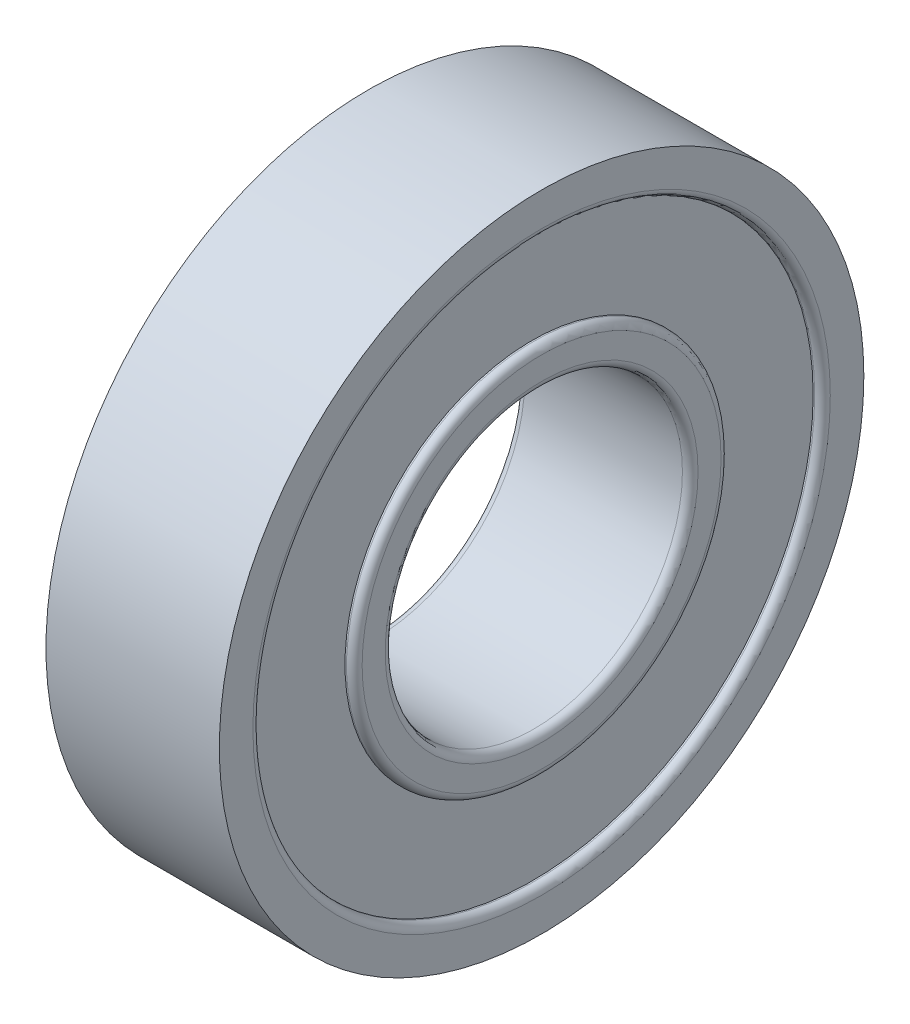
ISO-10303-21;
HEADER;
FILE_DESCRIPTION(('STEP AP214'),'2;1');
FILE_NAME('part.step','',(''),(''),'','','');
FILE_SCHEMA(('AUTOMOTIVE_DESIGN { 1 0 10303 214 1 1 1 1 }'));
ENDSEC;
DATA;
#1=APPLICATION_CONTEXT('core data for automotive mechanical design processes');
#2=APPLICATION_PROTOCOL_DEFINITION('international standard','automotive_design',2000,#1);
#3=PRODUCT_CONTEXT('',#1,'mechanical');
#4=PRODUCT('Part','Part','',(#3));
#5=PRODUCT_RELATED_PRODUCT_CATEGORY('part','',(#4));
#6=PRODUCT_DEFINITION_FORMATION('','',#4);
#7=PRODUCT_DEFINITION_CONTEXT('part definition',#1,'design');
#8=PRODUCT_DEFINITION('design','',#6,#7);
#9=PRODUCT_DEFINITION_SHAPE('','',#8);
#10=(LENGTH_UNIT() NAMED_UNIT(*) SI_UNIT(.MILLI.,.METRE.));
#11=(NAMED_UNIT(*) PLANE_ANGLE_UNIT() SI_UNIT($,.RADIAN.));
#12=(NAMED_UNIT(*) SI_UNIT($,.STERADIAN.) SOLID_ANGLE_UNIT());
#13=UNCERTAINTY_MEASURE_WITH_UNIT(LENGTH_MEASURE(1.E-05),#10,'distance_accuracy_value','');
#14=(GEOMETRIC_REPRESENTATION_CONTEXT(3) GLOBAL_UNCERTAINTY_ASSIGNED_CONTEXT((#13)) GLOBAL_UNIT_ASSIGNED_CONTEXT((#10,
#11,#12)) REPRESENTATION_CONTEXT('',''));
#15=CARTESIAN_POINT('',(0.,0.,0.));
#16=DIRECTION('',(0.,0.,1.));
#17=DIRECTION('',(1.,0.,0.));
#18=AXIS2_PLACEMENT_3D('',#15,#16,#17);
#19=CARTESIAN_POINT('',(-5.555,0.,0.));
#20=DIRECTION('',(1.,0.,0.));
#21=DIRECTION('',(0.,0.,-1.));
#22=AXIS2_PLACEMENT_3D('',#19,#20,#21);
#23=PLANE('',#22);
#24=CARTESIAN_POINT('',(-5.555,0.,0.));
#25=DIRECTION('',(1.,0.,0.));
#26=DIRECTION('',(0.,0.,-1.));
#27=AXIS2_PLACEMENT_3D('',#24,#25,#26);
#28=CIRCLE('',#27,11.5);
#29=CARTESIAN_POINT('',(-5.555,0.,-11.5));
#30=VERTEX_POINT('',#29);
#31=EDGE_CURVE('E74',#30,#30,#28,.F.);
#32=ORIENTED_EDGE('',*,*,#31,.T.);
#33=EDGE_LOOP('',(#32));
#34=FACE_BOUND('',#33,.T.);
#35=CARTESIAN_POINT('',(-5.555,0.,0.));
#36=DIRECTION('',(1.,0.,0.));
#37=DIRECTION('',(0.,0.,-1.));
#38=AXIS2_PLACEMENT_3D('',#35,#36,#37);
#39=CIRCLE('',#38,10.025);
#40=CARTESIAN_POINT('',(-5.555,0.,-10.025));
#41=VERTEX_POINT('',#40);
#42=EDGE_CURVE('E77',#41,#41,#39,.T.);
#43=ORIENTED_EDGE('',*,*,#42,.T.);
#44=EDGE_LOOP('',(#43));
#45=FACE_BOUND('',#44,.T.);
#46=ADVANCED_FACE('F45',(#34,#45),#23,.F.);
#47=CARTESIAN_POINT('',(5.555,0.,0.));
#48=DIRECTION('',(1.,0.,0.));
#49=DIRECTION('',(0.,0.,-1.));
#50=AXIS2_PLACEMENT_3D('',#47,#48,#49);
#51=PLANE('',#50);
#52=CARTESIAN_POINT('',(5.555,0.,0.));
#53=DIRECTION('',(1.,0.,0.));
#54=DIRECTION('',(0.,0.,-1.));
#55=AXIS2_PLACEMENT_3D('',#52,#53,#54);
#56=CIRCLE('',#55,10.025);
#57=CARTESIAN_POINT('',(5.555,0.,-10.025));
#58=VERTEX_POINT('',#57);
#59=EDGE_CURVE('E60',#58,#58,#56,.F.);
#60=ORIENTED_EDGE('',*,*,#59,.T.);
#61=EDGE_LOOP('',(#60));
#62=FACE_BOUND('',#61,.T.);
#63=CARTESIAN_POINT('',(5.555,0.,0.));
#64=DIRECTION('',(1.,0.,0.));
#65=DIRECTION('',(0.,0.,-1.));
#66=AXIS2_PLACEMENT_3D('',#63,#64,#65);
#67=CIRCLE('',#66,11.5);
#68=CARTESIAN_POINT('',(5.555,0.,-11.5));
#69=VERTEX_POINT('',#68);
#70=EDGE_CURVE('E65',#69,#69,#67,.T.);
#71=ORIENTED_EDGE('',*,*,#70,.T.);
#72=EDGE_LOOP('',(#71));
#73=FACE_BOUND('',#72,.T.);
#74=ADVANCED_FACE('F127',(#62,#73),#51,.T.);
#75=CARTESIAN_POINT('',(5.555,0.,0.));
#76=DIRECTION('',(1.,0.,0.));
#77=DIRECTION('',(0.,0.,-1.));
#78=AXIS2_PLACEMENT_3D('',#75,#76,#77);
#79=CIRCLE('',#78,18.5);
#80=CARTESIAN_POINT('',(5.555,0.,-18.5));
#81=VERTEX_POINT('',#80);
#82=EDGE_CURVE('E10',#81,#81,#79,.F.);
#83=ORIENTED_EDGE('',*,*,#82,.T.);
#84=EDGE_LOOP('',(#83));
#85=FACE_BOUND('',#84,.T.);
#86=CARTESIAN_POINT('',(5.555,0.,0.));
#87=DIRECTION('',(1.,0.,0.));
#88=DIRECTION('',(0.,0.,-1.));
#89=AXIS2_PLACEMENT_3D('',#86,#87,#88);
#90=CIRCLE('',#89,20.65);
#91=CARTESIAN_POINT('',(5.555,0.,-20.65));
#92=VERTEX_POINT('',#91);
#93=EDGE_CURVE('E89',#92,#92,#90,.T.);
#94=ORIENTED_EDGE('',*,*,#93,.T.);
#95=EDGE_LOOP('',(#94));
#96=FACE_BOUND('',#95,.T.);
#97=ADVANCED_FACE('F135',(#85,#96),#51,.T.);
#98=CARTESIAN_POINT('',(-5.555,0.,0.));
#99=DIRECTION('',(1.,0.,0.));
#100=DIRECTION('',(0.,0.,-1.));
#101=AXIS2_PLACEMENT_3D('',#98,#99,#100);
#102=CIRCLE('',#101,18.5);
#103=CARTESIAN_POINT('',(-5.555,0.,-18.5));
#104=VERTEX_POINT('',#103);
#105=EDGE_CURVE('E86',#104,#104,#102,.T.);
#106=ORIENTED_EDGE('',*,*,#105,.T.);
#107=EDGE_LOOP('',(#106));
#108=FACE_BOUND('',#107,.T.);
#109=CARTESIAN_POINT('',(-5.555,0.,0.));
#110=DIRECTION('',(1.,0.,0.));
#111=DIRECTION('',(0.,0.,-1.));
#112=AXIS2_PLACEMENT_3D('',#109,#110,#111);
#113=CIRCLE('',#112,20.65);
#114=CARTESIAN_POINT('',(-5.555,0.,-20.65));
#115=VERTEX_POINT('',#114);
#116=EDGE_CURVE('E90',#115,#115,#113,.T.);
#117=ORIENTED_EDGE('',*,*,#116,.F.);
#118=EDGE_LOOP('',(#117));
#119=FACE_BOUND('',#118,.T.);
#120=ADVANCED_FACE('F130',(#108,#119),#23,.F.);
#121=CARTESIAN_POINT('',(5.555,0.,0.));
#122=DIRECTION('',(-1.,0.,0.));
#123=DIRECTION('',(0.,0.,1.));
#124=AXIS2_PLACEMENT_3D('',#121,#122,#123);
#125=CYLINDRICAL_SURFACE('',#124,20.65);
#126=ORIENTED_EDGE('',*,*,#93,.F.);
#127=EDGE_LOOP('',(#126));
#128=FACE_BOUND('',#127,.T.);
#129=ORIENTED_EDGE('',*,*,#116,.T.);
#130=EDGE_LOOP('',(#129));
#131=FACE_BOUND('',#130,.T.);
#132=ADVANCED_FACE('F141',(#128,#131),#125,.T.);
#133=CARTESIAN_POINT('',(5.555,0.,0.));
#134=DIRECTION('',(-1.,0.,0.));
#135=DIRECTION('',(0.,0.,1.));
#136=AXIS2_PLACEMENT_3D('',#133,#134,#135);
#137=CYLINDRICAL_SURFACE('',#136,9.525);
#138=CARTESIAN_POINT('',(-5.055,0.,0.));
#139=DIRECTION('',(1.,0.,0.));
#140=DIRECTION('',(0.,0.,-1.));
#141=AXIS2_PLACEMENT_3D('',#138,#139,#140);
#142=CIRCLE('',#141,9.525);
#143=CARTESIAN_POINT('',(-5.055,0.,-9.525));
#144=VERTEX_POINT('',#143);
#145=EDGE_CURVE('E68',#144,#144,#142,.F.);
#146=ORIENTED_EDGE('',*,*,#145,.T.);
#147=EDGE_LOOP('',(#146));
#148=FACE_BOUND('',#147,.T.);
#149=CARTESIAN_POINT('',(5.055,0.,0.));
#150=DIRECTION('',(1.,0.,0.));
#151=DIRECTION('',(0.,0.,-1.));
#152=AXIS2_PLACEMENT_3D('',#149,#150,#151);
#153=CIRCLE('',#152,9.525);
#154=CARTESIAN_POINT('',(5.055,0.,-9.525));
#155=VERTEX_POINT('',#154);
#156=EDGE_CURVE('E71',#155,#155,#153,.T.);
#157=ORIENTED_EDGE('',*,*,#156,.T.);
#158=EDGE_LOOP('',(#157));
#159=FACE_BOUND('',#158,.T.);
#160=ADVANCED_FACE('F148',(#148,#159),#137,.F.);
#161=CARTESIAN_POINT('',(4.955,0.,0.));
#162=DIRECTION('',(1.,0.,0.));
#163=DIRECTION('',(0.,0.,-1.));
#164=AXIS2_PLACEMENT_3D('',#161,#162,#163);
#165=CYLINDRICAL_SURFACE('',#164,18.);
#166=CARTESIAN_POINT('',(5.055,0.,0.));
#167=DIRECTION('',(1.,0.,0.));
#168=DIRECTION('',(0.,0.,-1.));
#169=AXIS2_PLACEMENT_3D('',#166,#167,#168);
#170=CIRCLE('',#169,18.);
#171=CARTESIAN_POINT('',(5.055,0.,-18.));
#172=VERTEX_POINT('',#171);
#173=EDGE_CURVE('E52',#172,#172,#170,.T.);
#174=ORIENTED_EDGE('',*,*,#173,.T.);
#175=EDGE_LOOP('',(#174));
#176=FACE_BOUND('',#175,.T.);
#177=CARTESIAN_POINT('',(4.955,0.,0.));
#178=DIRECTION('',(1.,0.,0.));
#179=DIRECTION('',(0.,0.,-1.));
#180=AXIS2_PLACEMENT_3D('',#177,#178,#179);
#181=CIRCLE('',#180,18.);
#182=CARTESIAN_POINT('',(4.955,0.,-18.));
#183=VERTEX_POINT('',#182);
#184=EDGE_CURVE('E93',#183,#183,#181,.T.);
#185=ORIENTED_EDGE('',*,*,#184,.F.);
#186=EDGE_LOOP('',(#185));
#187=FACE_BOUND('',#186,.T.);
#188=ADVANCED_FACE('F160',(#176,#187),#165,.F.);
#189=CARTESIAN_POINT('',(4.955,0.,0.));
#190=DIRECTION('',(1.,0.,0.));
#191=DIRECTION('',(0.,0.,-1.));
#192=AXIS2_PLACEMENT_3D('',#189,#190,#191);
#193=PLANE('',#192);
#194=CARTESIAN_POINT('',(4.955,0.,0.));
#195=DIRECTION('',(1.,0.,0.));
#196=DIRECTION('',(0.,0.,-1.));
#197=AXIS2_PLACEMENT_3D('',#194,#195,#196);
#198=CIRCLE('',#197,12.);
#199=CARTESIAN_POINT('',(4.955,0.,-12.));
#200=VERTEX_POINT('',#199);
#201=EDGE_CURVE('E98',#200,#200,#198,.T.);
#202=ORIENTED_EDGE('',*,*,#201,.F.);
#203=EDGE_LOOP('',(#202));
#204=FACE_BOUND('',#203,.T.);
#205=ORIENTED_EDGE('',*,*,#184,.T.);
#206=EDGE_LOOP('',(#205));
#207=FACE_BOUND('',#206,.T.);
#208=ADVANCED_FACE('F164',(#204,#207),#193,.T.);
#209=CARTESIAN_POINT('',(4.955,0.,0.));
#210=DIRECTION('',(1.,0.,0.));
#211=DIRECTION('',(0.,0.,-1.));
#212=AXIS2_PLACEMENT_3D('',#209,#210,#211);
#213=CYLINDRICAL_SURFACE('',#212,12.);
#214=CARTESIAN_POINT('',(5.055,0.,0.));
#215=DIRECTION('',(1.,0.,0.));
#216=DIRECTION('',(0.,0.,-1.));
#217=AXIS2_PLACEMENT_3D('',#214,#215,#216);
#218=CIRCLE('',#217,12.);
#219=CARTESIAN_POINT('',(5.055,0.,-12.));
#220=VERTEX_POINT('',#219);
#221=EDGE_CURVE('E56',#220,#220,#218,.F.);
#222=ORIENTED_EDGE('',*,*,#221,.T.);
#223=EDGE_LOOP('',(#222));
#224=FACE_BOUND('',#223,.T.);
#225=ORIENTED_EDGE('',*,*,#201,.T.);
#226=EDGE_LOOP('',(#225));
#227=FACE_BOUND('',#226,.T.);
#228=ADVANCED_FACE('F167',(#224,#227),#213,.T.);
#229=CARTESIAN_POINT('',(-4.955,0.,0.));
#230=DIRECTION('',(-1.,0.,0.));
#231=DIRECTION('',(0.,0.,-1.));
#232=AXIS2_PLACEMENT_3D('',#229,#230,#231);
#233=PLANE('',#232);
#234=CARTESIAN_POINT('',(-4.955,0.,0.));
#235=DIRECTION('',(1.,0.,0.));
#236=DIRECTION('',(0.,0.,-1.));
#237=AXIS2_PLACEMENT_3D('',#234,#235,#236);
#238=CIRCLE('',#237,18.);
#239=CARTESIAN_POINT('',(-4.955,0.,-18.));
#240=VERTEX_POINT('',#239);
#241=EDGE_CURVE('E101',#240,#240,#238,.T.);
#242=ORIENTED_EDGE('',*,*,#241,.F.);
#243=EDGE_LOOP('',(#242));
#244=FACE_BOUND('',#243,.T.);
#245=CARTESIAN_POINT('',(-4.955,0.,0.));
#246=DIRECTION('',(1.,0.,0.));
#247=DIRECTION('',(0.,0.,-1.));
#248=AXIS2_PLACEMENT_3D('',#245,#246,#247);
#249=CIRCLE('',#248,12.);
#250=CARTESIAN_POINT('',(-4.955,0.,-12.));
#251=VERTEX_POINT('',#250);
#252=EDGE_CURVE('E104',#251,#251,#249,.T.);
#253=ORIENTED_EDGE('',*,*,#252,.T.);
#254=EDGE_LOOP('',(#253));
#255=FACE_BOUND('',#254,.T.);
#256=ADVANCED_FACE('F108',(#244,#255),#233,.T.);
#257=CARTESIAN_POINT('',(-4.955,0.,0.));
#258=DIRECTION('',(-1.,0.,0.));
#259=DIRECTION('',(0.,0.,1.));
#260=AXIS2_PLACEMENT_3D('',#257,#258,#259);
#261=CYLINDRICAL_SURFACE('',#260,18.);
#262=CARTESIAN_POINT('',(-5.055,0.,0.));
#263=DIRECTION('',(1.,0.,0.));
#264=DIRECTION('',(0.,0.,-1.));
#265=AXIS2_PLACEMENT_3D('',#262,#263,#264);
#266=CIRCLE('',#265,18.);
#267=CARTESIAN_POINT('',(-5.055,0.,-18.));
#268=VERTEX_POINT('',#267);
#269=EDGE_CURVE('E83',#268,#268,#266,.F.);
#270=ORIENTED_EDGE('',*,*,#269,.T.);
#271=EDGE_LOOP('',(#270));
#272=FACE_BOUND('',#271,.T.);
#273=ORIENTED_EDGE('',*,*,#241,.T.);
#274=EDGE_LOOP('',(#273));
#275=FACE_BOUND('',#274,.T.);
#276=ADVANCED_FACE('F113',(#272,#275),#261,.F.);
#277=CARTESIAN_POINT('',(-4.955,0.,0.));
#278=DIRECTION('',(-1.,0.,0.));
#279=DIRECTION('',(0.,0.,1.));
#280=AXIS2_PLACEMENT_3D('',#277,#278,#279);
#281=CYLINDRICAL_SURFACE('',#280,12.);
#282=CARTESIAN_POINT('',(-5.055,0.,0.));
#283=DIRECTION('',(1.,0.,0.));
#284=DIRECTION('',(0.,0.,-1.));
#285=AXIS2_PLACEMENT_3D('',#282,#283,#284);
#286=CIRCLE('',#285,12.);
#287=CARTESIAN_POINT('',(-5.055,0.,-12.));
#288=VERTEX_POINT('',#287);
#289=EDGE_CURVE('E80',#288,#288,#286,.T.);
#290=ORIENTED_EDGE('',*,*,#289,.T.);
#291=EDGE_LOOP('',(#290));
#292=FACE_BOUND('',#291,.T.);
#293=ORIENTED_EDGE('',*,*,#252,.F.);
#294=EDGE_LOOP('',(#293));
#295=FACE_BOUND('',#294,.T.);
#296=ADVANCED_FACE('F110',(#292,#295),#281,.T.);
#297=CARTESIAN_POINT('',(-5.055,0.,0.));
#298=DIRECTION('',(1.,0.,0.));
#299=DIRECTION('',(0.,0.,-1.));
#300=AXIS2_PLACEMENT_3D('',#297,#298,#299);
#301=TOROIDAL_SURFACE('',#300,18.5,0.5);
#302=ORIENTED_EDGE('',*,*,#269,.F.);
#303=EDGE_LOOP('',(#302));
#304=FACE_BOUND('',#303,.T.);
#305=ORIENTED_EDGE('',*,*,#105,.F.);
#306=EDGE_LOOP('',(#305));
#307=FACE_BOUND('',#306,.T.);
#308=ADVANCED_FACE('F112',(#304,#307),#301,.T.);
#309=CARTESIAN_POINT('',(-5.055,0.,0.));
#310=DIRECTION('',(1.,0.,0.));
#311=DIRECTION('',(0.,0.,-1.));
#312=AXIS2_PLACEMENT_3D('',#309,#310,#311);
#313=TOROIDAL_SURFACE('',#312,11.5,0.5);
#314=ORIENTED_EDGE('',*,*,#31,.F.);
#315=EDGE_LOOP('',(#314));
#316=FACE_BOUND('',#315,.T.);
#317=ORIENTED_EDGE('',*,*,#289,.F.);
#318=EDGE_LOOP('',(#317));
#319=FACE_BOUND('',#318,.T.);
#320=ADVANCED_FACE('F120',(#316,#319),#313,.T.);
#321=CARTESIAN_POINT('',(-5.055,0.,0.));
#322=DIRECTION('',(1.,0.,0.));
#323=DIRECTION('',(0.,0.,-1.));
#324=AXIS2_PLACEMENT_3D('',#321,#322,#323);
#325=TOROIDAL_SURFACE('',#324,10.025,0.5);
#326=ORIENTED_EDGE('',*,*,#145,.F.);
#327=EDGE_LOOP('',(#326));
#328=FACE_BOUND('',#327,.T.);
#329=ORIENTED_EDGE('',*,*,#42,.F.);
#330=EDGE_LOOP('',(#329));
#331=FACE_BOUND('',#330,.T.);
#332=ADVANCED_FACE('F220',(#328,#331),#325,.T.);
#333=CARTESIAN_POINT('',(5.055,0.,0.));
#334=DIRECTION('',(1.,0.,0.));
#335=DIRECTION('',(0.,0.,-1.));
#336=AXIS2_PLACEMENT_3D('',#333,#334,#335);
#337=TOROIDAL_SURFACE('',#336,10.025,0.5);
#338=ORIENTED_EDGE('',*,*,#59,.F.);
#339=EDGE_LOOP('',(#338));
#340=FACE_BOUND('',#339,.T.);
#341=ORIENTED_EDGE('',*,*,#156,.F.);
#342=EDGE_LOOP('',(#341));
#343=FACE_BOUND('',#342,.T.);
#344=ADVANCED_FACE('F230',(#340,#343),#337,.T.);
#345=CARTESIAN_POINT('',(5.055,0.,0.));
#346=DIRECTION('',(1.,0.,0.));
#347=DIRECTION('',(0.,0.,-1.));
#348=AXIS2_PLACEMENT_3D('',#345,#346,#347);
#349=TOROIDAL_SURFACE('',#348,11.5,0.5);
#350=ORIENTED_EDGE('',*,*,#221,.F.);
#351=EDGE_LOOP('',(#350));
#352=FACE_BOUND('',#351,.T.);
#353=ORIENTED_EDGE('',*,*,#70,.F.);
#354=EDGE_LOOP('',(#353));
#355=FACE_BOUND('',#354,.T.);
#356=ADVANCED_FACE('F240',(#352,#355),#349,.T.);
#357=CARTESIAN_POINT('',(5.055,0.,0.));
#358=DIRECTION('',(1.,0.,0.));
#359=DIRECTION('',(0.,0.,-1.));
#360=AXIS2_PLACEMENT_3D('',#357,#358,#359);
#361=TOROIDAL_SURFACE('',#360,18.5,0.5);
#362=ORIENTED_EDGE('',*,*,#82,.F.);
#363=EDGE_LOOP('',(#362));
#364=FACE_BOUND('',#363,.T.);
#365=ORIENTED_EDGE('',*,*,#173,.F.);
#366=EDGE_LOOP('',(#365));
#367=FACE_BOUND('',#366,.T.);
#368=ADVANCED_FACE('F47',(#364,#367),#361,.T.);
#369=CLOSED_SHELL('',(#46,#74,#97,#120,#132,#160,#188,#208,#228,#256,#276,#296,#308,#320,#332,
#344,#356,#368));
#370=MANIFOLD_SOLID_BREP('B2',#369);
#371=ADVANCED_BREP_SHAPE_REPRESENTATION('',(#18,#370),#14);
#372=SHAPE_DEFINITION_REPRESENTATION(#9,#371);
ENDSEC;
END-ISO-10303-21;
